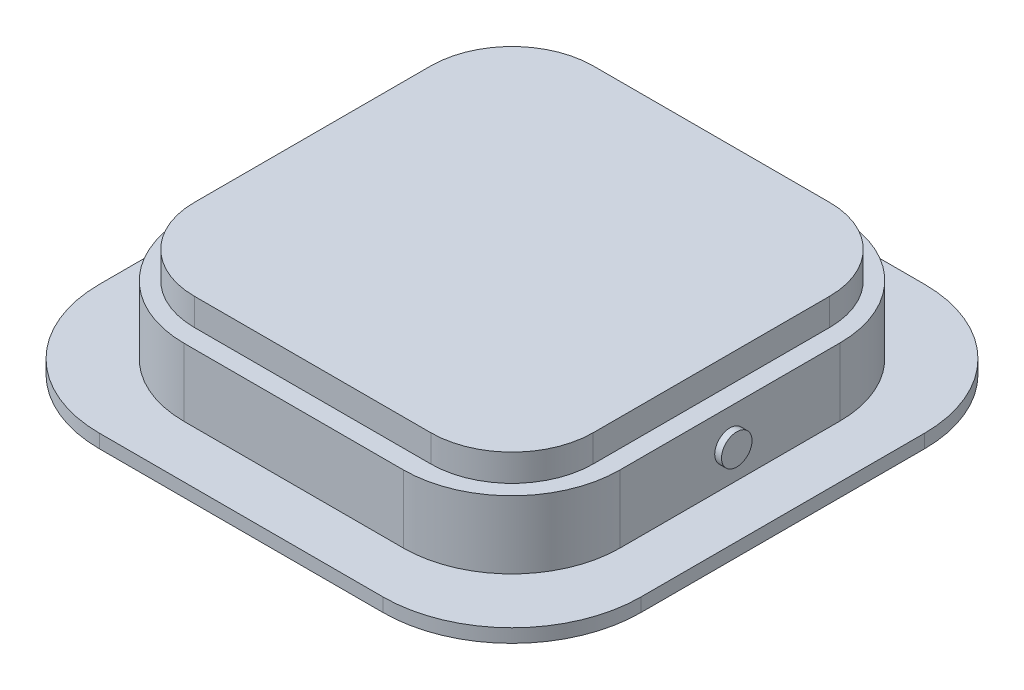
ISO-10303-21;
HEADER;
FILE_DESCRIPTION(('STEP AP214'),'2;1');
FILE_NAME('part.step','',(''),(''),'','','');
FILE_SCHEMA(('AUTOMOTIVE_DESIGN { 1 0 10303 214 1 1 1 1 }'));
ENDSEC;
DATA;
#1=APPLICATION_CONTEXT('core data for automotive mechanical design processes');
#2=APPLICATION_PROTOCOL_DEFINITION('international standard','automotive_design',2000,#1);
#3=PRODUCT_CONTEXT('',#1,'mechanical');
#4=PRODUCT('Part','Part','',(#3));
#5=PRODUCT_RELATED_PRODUCT_CATEGORY('part','',(#4));
#6=PRODUCT_DEFINITION_FORMATION('','',#4);
#7=PRODUCT_DEFINITION_CONTEXT('part definition',#1,'design');
#8=PRODUCT_DEFINITION('design','',#6,#7);
#9=PRODUCT_DEFINITION_SHAPE('','',#8);
#10=(LENGTH_UNIT() NAMED_UNIT(*) SI_UNIT(.MILLI.,.METRE.));
#11=(NAMED_UNIT(*) PLANE_ANGLE_UNIT() SI_UNIT($,.RADIAN.));
#12=(NAMED_UNIT(*) SI_UNIT($,.STERADIAN.) SOLID_ANGLE_UNIT());
#13=UNCERTAINTY_MEASURE_WITH_UNIT(LENGTH_MEASURE(1.E-05),#10,'distance_accuracy_value','');
#14=(GEOMETRIC_REPRESENTATION_CONTEXT(3) GLOBAL_UNCERTAINTY_ASSIGNED_CONTEXT((#13)) GLOBAL_UNIT_ASSIGNED_CONTEXT((#10,
#11,#12)) REPRESENTATION_CONTEXT('',''));
#15=CARTESIAN_POINT('',(0.,0.,0.));
#16=DIRECTION('',(0.,0.,1.));
#17=DIRECTION('',(1.,0.,0.));
#18=AXIS2_PLACEMENT_3D('',#15,#16,#17);
#19=CARTESIAN_POINT('',(16.1,-5.,-8.12228811403894));
#20=DIRECTION('',(-1.,0.,0.));
#21=DIRECTION('',(0.,0.,1.));
#22=AXIS2_PLACEMENT_3D('',#19,#20,#21);
#23=PLANE('',#22);
#24=DIRECTION('',(0.,0.,1.));
#25=VECTOR('',#24,1.);
#26=CARTESIAN_POINT('',(16.1,0.,-8.12228811403894));
#27=LINE('',#26,#25);
#28=CARTESIAN_POINT('',(16.1,0.,-8.12228811403894));
#29=VERTEX_POINT('',#28);
#30=CARTESIAN_POINT('',(16.1,0.,8.12228811403895));
#31=VERTEX_POINT('',#30);
#32=EDGE_CURVE('E367',#29,#31,#27,.T.);
#33=ORIENTED_EDGE('',*,*,#32,.T.);
#34=DIRECTION('',(0.,1.,0.));
#35=VECTOR('',#34,1.);
#36=CARTESIAN_POINT('',(16.1,-5.,8.12228811403895));
#37=LINE('',#36,#35);
#38=CARTESIAN_POINT('',(16.1,-5.,8.12228811403895));
#39=VERTEX_POINT('',#38);
#40=EDGE_CURVE('E397',#39,#31,#37,.T.);
#41=ORIENTED_EDGE('',*,*,#40,.F.);
#42=DIRECTION('',(0.,0.,1.));
#43=VECTOR('',#42,1.);
#44=CARTESIAN_POINT('',(16.1,-5.,-8.12228811403894));
#45=LINE('',#44,#43);
#46=CARTESIAN_POINT('',(16.1,-5.,-8.12228811403894));
#47=VERTEX_POINT('',#46);
#48=EDGE_CURVE('E342',#47,#39,#45,.T.);
#49=ORIENTED_EDGE('',*,*,#48,.F.);
#50=DIRECTION('',(0.,1.,0.));
#51=VECTOR('',#50,1.);
#52=CARTESIAN_POINT('',(16.1,-5.,-8.12228811403894));
#53=LINE('',#52,#51);
#54=EDGE_CURVE('E400',#47,#29,#53,.T.);
#55=ORIENTED_EDGE('',*,*,#54,.T.);
#56=EDGE_LOOP('',(#33,#41,#49,#55));
#57=FACE_BOUND('',#56,.T.);
#58=CARTESIAN_POINT('',(16.1,-2.5,0.));
#59=DIRECTION('',(-1.,0.,0.));
#60=DIRECTION('',(0.,0.,1.));
#61=AXIS2_PLACEMENT_3D('',#58,#59,#60);
#62=CIRCLE('',#61,1.12761712492703);
#63=CARTESIAN_POINT('',(16.1,-2.5,1.12761712492703));
#64=VERTEX_POINT('',#63);
#65=EDGE_CURVE('E13',#64,#64,#62,.F.);
#66=ORIENTED_EDGE('',*,*,#65,.F.);
#67=EDGE_LOOP('',(#66));
#68=FACE_BOUND('',#67,.T.);
#69=ADVANCED_FACE('F45',(#57,#68),#23,.F.);
#70=CARTESIAN_POINT('',(-10.47496,-6.,-10.475));
#71=DIRECTION('',(0.,1.,0.));
#72=DIRECTION('',(0.,0.,1.));
#73=AXIS2_PLACEMENT_3D('',#70,#71,#72);
#74=PLANE('',#73);
#75=CARTESIAN_POINT('',(-10.47496,-6.,-10.475));
#76=DIRECTION('',(0.,-1.,0.));
#77=DIRECTION('',(0.,0.,1.));
#78=AXIS2_PLACEMENT_3D('',#75,#76,#77);
#79=CIRCLE('',#78,9.525);
#80=CARTESIAN_POINT('',(-19.99996,-6.,-10.4749999999999));
#81=VERTEX_POINT('',#80);
#82=CARTESIAN_POINT('',(-10.4749599999999,-6.,-20.));
#83=VERTEX_POINT('',#82);
#84=EDGE_CURVE('E284',#81,#83,#79,.T.);
#85=ORIENTED_EDGE('',*,*,#84,.T.);
#86=DIRECTION('',(1.,0.,0.));
#87=VECTOR('',#86,1.);
#88=CARTESIAN_POINT('',(10.4749599999999,-6.,-20.));
#89=LINE('',#88,#87);
#90=CARTESIAN_POINT('',(10.4749599999999,-6.,-20.));
#91=VERTEX_POINT('',#90);
#92=EDGE_CURVE('E287',#83,#91,#89,.T.);
#93=ORIENTED_EDGE('',*,*,#92,.T.);
#94=CARTESIAN_POINT('',(10.47496,-6.,-10.475));
#95=DIRECTION('',(0.,-1.,0.));
#96=DIRECTION('',(0.,0.,-1.));
#97=AXIS2_PLACEMENT_3D('',#94,#95,#96);
#98=CIRCLE('',#97,9.525);
#99=CARTESIAN_POINT('',(19.99996,-6.,-10.4749999999999));
#100=VERTEX_POINT('',#99);
#101=EDGE_CURVE('E290',#91,#100,#98,.T.);
#102=ORIENTED_EDGE('',*,*,#101,.T.);
#103=DIRECTION('',(0.,0.,1.));
#104=VECTOR('',#103,1.);
#105=CARTESIAN_POINT('',(19.99996,-6.,-10.4749999999999));
#106=LINE('',#105,#104);
#107=CARTESIAN_POINT('',(19.99996,-6.,10.4749999999999));
#108=VERTEX_POINT('',#107);
#109=EDGE_CURVE('E292',#100,#108,#106,.T.);
#110=ORIENTED_EDGE('',*,*,#109,.T.);
#111=CARTESIAN_POINT('',(10.47496,-6.,10.475));
#112=DIRECTION('',(0.,-1.,0.));
#113=DIRECTION('',(0.,0.,-1.));
#114=AXIS2_PLACEMENT_3D('',#111,#112,#113);
#115=CIRCLE('',#114,9.525);
#116=CARTESIAN_POINT('',(10.4749599999999,-6.,20.));
#117=VERTEX_POINT('',#116);
#118=EDGE_CURVE('E294',#108,#117,#115,.T.);
#119=ORIENTED_EDGE('',*,*,#118,.T.);
#120=DIRECTION('',(-1.,0.,0.));
#121=VECTOR('',#120,1.);
#122=CARTESIAN_POINT('',(10.4749599999999,-6.,20.));
#123=LINE('',#122,#121);
#124=CARTESIAN_POINT('',(-10.4749599999999,-6.,20.));
#125=VERTEX_POINT('',#124);
#126=EDGE_CURVE('E296',#117,#125,#123,.T.);
#127=ORIENTED_EDGE('',*,*,#126,.T.);
#128=CARTESIAN_POINT('',(-10.47496,-6.,10.475));
#129=DIRECTION('',(0.,-1.,0.));
#130=DIRECTION('',(0.,0.,-1.));
#131=AXIS2_PLACEMENT_3D('',#128,#129,#130);
#132=CIRCLE('',#131,9.525);
#133=CARTESIAN_POINT('',(-19.99996,-6.,10.4749999999999));
#134=VERTEX_POINT('',#133);
#135=EDGE_CURVE('E298',#125,#134,#132,.T.);
#136=ORIENTED_EDGE('',*,*,#135,.T.);
#137=DIRECTION('',(0.,0.,-1.));
#138=VECTOR('',#137,1.);
#139=CARTESIAN_POINT('',(-19.99996,-6.,-10.4749999999999));
#140=LINE('',#139,#138);
#141=EDGE_CURVE('E300',#134,#81,#140,.T.);
#142=ORIENTED_EDGE('',*,*,#141,.T.);
#143=EDGE_LOOP('',(#85,#93,#102,#110,#119,#127,#136,#142));
#144=FACE_BOUND('',#143,.T.);
#145=CARTESIAN_POINT('',(-9.50000000000001,-6.,-10.25));
#146=DIRECTION('',(0.,-1.,0.));
#147=DIRECTION('',(0.,0.,1.));
#148=AXIS2_PLACEMENT_3D('',#145,#146,#147);
#149=CIRCLE('',#148,3.);
#150=CARTESIAN_POINT('',(-12.5,-6.,-10.25));
#151=VERTEX_POINT('',#150);
#152=CARTESIAN_POINT('',(-9.49999999999998,-6.,-13.25));
#153=VERTEX_POINT('',#152);
#154=EDGE_CURVE('E274',#151,#153,#149,.T.);
#155=ORIENTED_EDGE('',*,*,#154,.F.);
#156=DIRECTION('',(0.,0.,-1.));
#157=VECTOR('',#156,1.);
#158=CARTESIAN_POINT('',(-12.5,-6.,-10.25));
#159=LINE('',#158,#157);
#160=CARTESIAN_POINT('',(-12.5,-6.,10.25));
#161=VERTEX_POINT('',#160);
#162=EDGE_CURVE('E271',#161,#151,#159,.T.);
#163=ORIENTED_EDGE('',*,*,#162,.F.);
#164=CARTESIAN_POINT('',(-9.5,-6.,10.25));
#165=DIRECTION('',(0.,-1.,0.));
#166=DIRECTION('',(0.,0.,-1.));
#167=AXIS2_PLACEMENT_3D('',#164,#165,#166);
#168=CIRCLE('',#167,3.);
#169=CARTESIAN_POINT('',(-9.5,-6.,13.25));
#170=VERTEX_POINT('',#169);
#171=EDGE_CURVE('E670',#170,#161,#168,.T.);
#172=ORIENTED_EDGE('',*,*,#171,.F.);
#173=DIRECTION('',(-1.,0.,0.));
#174=VECTOR('',#173,1.);
#175=CARTESIAN_POINT('',(9.49999999999998,-6.,13.25));
#176=LINE('',#175,#174);
#177=CARTESIAN_POINT('',(9.49999999999998,-6.,13.25));
#178=VERTEX_POINT('',#177);
#179=EDGE_CURVE('E667',#178,#170,#176,.T.);
#180=ORIENTED_EDGE('',*,*,#179,.F.);
#181=CARTESIAN_POINT('',(9.5,-6.,10.25));
#182=DIRECTION('',(0.,-1.,0.));
#183=DIRECTION('',(0.,0.,-1.));
#184=AXIS2_PLACEMENT_3D('',#181,#182,#183);
#185=CIRCLE('',#184,3.);
#186=CARTESIAN_POINT('',(12.5,-6.,10.25));
#187=VERTEX_POINT('',#186);
#188=EDGE_CURVE('E664',#187,#178,#185,.T.);
#189=ORIENTED_EDGE('',*,*,#188,.F.);
#190=DIRECTION('',(0.,0.,1.));
#191=VECTOR('',#190,1.);
#192=CARTESIAN_POINT('',(12.5,-6.,-10.25));
#193=LINE('',#192,#191);
#194=CARTESIAN_POINT('',(12.5,-6.,-10.25));
#195=VERTEX_POINT('',#194);
#196=EDGE_CURVE('E661',#195,#187,#193,.T.);
#197=ORIENTED_EDGE('',*,*,#196,.F.);
#198=CARTESIAN_POINT('',(9.5,-6.,-10.25));
#199=DIRECTION('',(0.,-1.,0.));
#200=DIRECTION('',(0.,0.,-1.));
#201=AXIS2_PLACEMENT_3D('',#198,#199,#200);
#202=CIRCLE('',#201,3.);
#203=CARTESIAN_POINT('',(9.49999999999998,-6.,-13.25));
#204=VERTEX_POINT('',#203);
#205=EDGE_CURVE('E65',#204,#195,#202,.T.);
#206=ORIENTED_EDGE('',*,*,#205,.F.);
#207=DIRECTION('',(1.,0.,0.));
#208=VECTOR('',#207,1.);
#209=CARTESIAN_POINT('',(9.49999999999998,-6.,-13.25));
#210=LINE('',#209,#208);
#211=EDGE_CURVE('E60',#153,#204,#210,.T.);
#212=ORIENTED_EDGE('',*,*,#211,.F.);
#213=EDGE_LOOP('',(#155,#163,#172,#180,#189,#197,#206,#212));
#214=FACE_BOUND('',#213,.T.);
#215=ADVANCED_FACE('F511',(#144,#214),#74,.F.);
#216=CARTESIAN_POINT('',(-8.732,2.,8.73200000000001));
#217=DIRECTION('',(0.,-1.,0.));
#218=DIRECTION('',(0.,0.,-1.));
#219=AXIS2_PLACEMENT_3D('',#216,#217,#218);
#220=CYLINDRICAL_SURFACE('',#219,6.);
#221=CARTESIAN_POINT('',(-8.732,0.,8.73200000000001));
#222=DIRECTION('',(0.,1.,0.));
#223=DIRECTION('',(0.,0.,-1.));
#224=AXIS2_PLACEMENT_3D('',#221,#222,#223);
#225=CIRCLE('',#224,6.);
#226=CARTESIAN_POINT('',(-14.732,0.,8.73199999999997));
#227=VERTEX_POINT('',#226);
#228=CARTESIAN_POINT('',(-8.73199999999995,0.,14.732));
#229=VERTEX_POINT('',#228);
#230=EDGE_CURVE('E403',#227,#229,#225,.T.);
#231=ORIENTED_EDGE('',*,*,#230,.T.);
#232=DIRECTION('',(0.,-1.,0.));
#233=VECTOR('',#232,1.);
#234=CARTESIAN_POINT('',(-8.73199999999996,2.,14.732));
#235=LINE('',#234,#233);
#236=CARTESIAN_POINT('',(-8.73199999999996,2.,14.732));
#237=VERTEX_POINT('',#236);
#238=EDGE_CURVE('E53',#237,#229,#235,.T.);
#239=ORIENTED_EDGE('',*,*,#238,.F.);
#240=CARTESIAN_POINT('',(-8.732,2.,8.73200000000001));
#241=DIRECTION('',(0.,1.,0.));
#242=DIRECTION('',(0.,0.,-1.));
#243=AXIS2_PLACEMENT_3D('',#240,#241,#242);
#244=CIRCLE('',#243,6.);
#245=CARTESIAN_POINT('',(-14.732,2.,8.73199999999997));
#246=VERTEX_POINT('',#245);
#247=EDGE_CURVE('E404',#246,#237,#244,.T.);
#248=ORIENTED_EDGE('',*,*,#247,.F.);
#249=DIRECTION('',(0.,-1.,0.));
#250=VECTOR('',#249,1.);
#251=CARTESIAN_POINT('',(-14.732,2.,8.73199999999997));
#252=LINE('',#251,#250);
#253=EDGE_CURVE('E422',#246,#227,#252,.T.);
#254=ORIENTED_EDGE('',*,*,#253,.T.);
#255=EDGE_LOOP('',(#231,#239,#248,#254));
#256=FACE_BOUND('',#255,.T.);
#257=ADVANCED_FACE('F47',(#256),#220,.T.);
#258=CARTESIAN_POINT('',(8.73199999999995,2.,14.732));
#259=DIRECTION('',(0.,0.,-1.));
#260=DIRECTION('',(-1.,0.,0.));
#261=AXIS2_PLACEMENT_3D('',#258,#259,#260);
#262=PLANE('',#261);
#263=DIRECTION('',(1.,0.,0.));
#264=VECTOR('',#263,1.);
#265=CARTESIAN_POINT('',(8.73199999999995,0.,14.732));
#266=LINE('',#265,#264);
#267=CARTESIAN_POINT('',(8.73199999999995,0.,14.732));
#268=VERTEX_POINT('',#267);
#269=EDGE_CURVE('E425',#229,#268,#266,.T.);
#270=ORIENTED_EDGE('',*,*,#269,.T.);
#271=DIRECTION('',(0.,-1.,0.));
#272=VECTOR('',#271,1.);
#273=CARTESIAN_POINT('',(8.73199999999995,2.,14.732));
#274=LINE('',#273,#272);
#275=CARTESIAN_POINT('',(8.73199999999995,2.,14.732));
#276=VERTEX_POINT('',#275);
#277=EDGE_CURVE('E462',#276,#268,#274,.T.);
#278=ORIENTED_EDGE('',*,*,#277,.F.);
#279=DIRECTION('',(1.,0.,0.));
#280=VECTOR('',#279,1.);
#281=CARTESIAN_POINT('',(8.73199999999995,2.,14.732));
#282=LINE('',#281,#280);
#283=EDGE_CURVE('E407',#237,#276,#282,.T.);
#284=ORIENTED_EDGE('',*,*,#283,.F.);
#285=ORIENTED_EDGE('',*,*,#238,.T.);
#286=EDGE_LOOP('',(#270,#278,#284,#285));
#287=FACE_BOUND('',#286,.T.);
#288=ADVANCED_FACE('F467',(#287),#262,.F.);
#289=CARTESIAN_POINT('',(8.732,2.,8.732));
#290=DIRECTION('',(0.,-1.,0.));
#291=DIRECTION('',(0.,0.,-1.));
#292=AXIS2_PLACEMENT_3D('',#289,#290,#291);
#293=CYLINDRICAL_SURFACE('',#292,6.);
#294=CARTESIAN_POINT('',(8.732,0.,8.732));
#295=DIRECTION('',(0.,1.,0.));
#296=DIRECTION('',(0.,0.,1.));
#297=AXIS2_PLACEMENT_3D('',#294,#295,#296);
#298=CIRCLE('',#297,6.);
#299=CARTESIAN_POINT('',(14.732,0.,8.73199999999996));
#300=VERTEX_POINT('',#299);
#301=EDGE_CURVE('E428',#268,#300,#298,.T.);
#302=ORIENTED_EDGE('',*,*,#301,.T.);
#303=DIRECTION('',(0.,-1.,0.));
#304=VECTOR('',#303,1.);
#305=CARTESIAN_POINT('',(14.732,2.,8.73199999999996));
#306=LINE('',#305,#304);
#307=CARTESIAN_POINT('',(14.732,2.,8.73199999999996));
#308=VERTEX_POINT('',#307);
#309=EDGE_CURVE('E459',#308,#300,#306,.T.);
#310=ORIENTED_EDGE('',*,*,#309,.F.);
#311=CARTESIAN_POINT('',(8.732,2.,8.732));
#312=DIRECTION('',(0.,1.,0.));
#313=DIRECTION('',(0.,0.,1.));
#314=AXIS2_PLACEMENT_3D('',#311,#312,#313);
#315=CIRCLE('',#314,6.);
#316=EDGE_CURVE('E410',#276,#308,#315,.T.);
#317=ORIENTED_EDGE('',*,*,#316,.F.);
#318=ORIENTED_EDGE('',*,*,#277,.T.);
#319=EDGE_LOOP('',(#302,#310,#317,#318));
#320=FACE_BOUND('',#319,.T.);
#321=ADVANCED_FACE('F496',(#320),#293,.T.);
#322=CARTESIAN_POINT('',(14.732,2.,8.73199999999995));
#323=DIRECTION('',(-1.,0.,0.));
#324=DIRECTION('',(0.,0.,1.));
#325=AXIS2_PLACEMENT_3D('',#322,#323,#324);
#326=PLANE('',#325);
#327=DIRECTION('',(0.,0.,-1.));
#328=VECTOR('',#327,1.);
#329=CARTESIAN_POINT('',(14.732,0.,8.73199999999995));
#330=LINE('',#329,#328);
#331=CARTESIAN_POINT('',(14.732,0.,-8.73199999999996));
#332=VERTEX_POINT('',#331);
#333=EDGE_CURVE('E431',#300,#332,#330,.T.);
#334=ORIENTED_EDGE('',*,*,#333,.T.);
#335=DIRECTION('',(0.,-1.,0.));
#336=VECTOR('',#335,1.);
#337=CARTESIAN_POINT('',(14.732,2.,-8.73199999999996));
#338=LINE('',#337,#336);
#339=CARTESIAN_POINT('',(14.732,2.,-8.73199999999996));
#340=VERTEX_POINT('',#339);
#341=EDGE_CURVE('E456',#340,#332,#338,.T.);
#342=ORIENTED_EDGE('',*,*,#341,.F.);
#343=DIRECTION('',(0.,0.,-1.));
#344=VECTOR('',#343,1.);
#345=CARTESIAN_POINT('',(14.732,2.,8.73199999999995));
#346=LINE('',#345,#344);
#347=EDGE_CURVE('E412',#308,#340,#346,.T.);
#348=ORIENTED_EDGE('',*,*,#347,.F.);
#349=ORIENTED_EDGE('',*,*,#309,.T.);
#350=EDGE_LOOP('',(#334,#342,#348,#349));
#351=FACE_BOUND('',#350,.T.);
#352=ADVANCED_FACE('F491',(#351),#326,.F.);
#353=CARTESIAN_POINT('',(8.732,2.,-8.732));
#354=DIRECTION('',(0.,-1.,0.));
#355=DIRECTION('',(0.,0.,-1.));
#356=AXIS2_PLACEMENT_3D('',#353,#354,#355);
#357=CYLINDRICAL_SURFACE('',#356,6.);
#358=CARTESIAN_POINT('',(8.732,0.,-8.732));
#359=DIRECTION('',(0.,1.,0.));
#360=DIRECTION('',(0.,0.,1.));
#361=AXIS2_PLACEMENT_3D('',#358,#359,#360);
#362=CIRCLE('',#361,6.);
#363=CARTESIAN_POINT('',(8.73199999999996,0.,-14.732));
#364=VERTEX_POINT('',#363);
#365=EDGE_CURVE('E434',#332,#364,#362,.T.);
#366=ORIENTED_EDGE('',*,*,#365,.T.);
#367=DIRECTION('',(0.,-1.,0.));
#368=VECTOR('',#367,1.);
#369=CARTESIAN_POINT('',(8.73199999999996,2.,-14.732));
#370=LINE('',#369,#368);
#371=CARTESIAN_POINT('',(8.73199999999996,2.,-14.732));
#372=VERTEX_POINT('',#371);
#373=EDGE_CURVE('E453',#372,#364,#370,.T.);
#374=ORIENTED_EDGE('',*,*,#373,.F.);
#375=CARTESIAN_POINT('',(8.732,2.,-8.732));
#376=DIRECTION('',(0.,1.,0.));
#377=DIRECTION('',(0.,0.,1.));
#378=AXIS2_PLACEMENT_3D('',#375,#376,#377);
#379=CIRCLE('',#378,6.);
#380=EDGE_CURVE('E414',#340,#372,#379,.T.);
#381=ORIENTED_EDGE('',*,*,#380,.F.);
#382=ORIENTED_EDGE('',*,*,#341,.T.);
#383=EDGE_LOOP('',(#366,#374,#381,#382));
#384=FACE_BOUND('',#383,.T.);
#385=ADVANCED_FACE('F488',(#384),#357,.T.);
#386=CARTESIAN_POINT('',(8.73199999999996,2.,-14.732));
#387=DIRECTION('',(0.,0.,1.));
#388=DIRECTION('',(1.,0.,0.));
#389=AXIS2_PLACEMENT_3D('',#386,#387,#388);
#390=PLANE('',#389);
#391=DIRECTION('',(-1.,0.,0.));
#392=VECTOR('',#391,1.);
#393=CARTESIAN_POINT('',(8.73199999999996,0.,-14.732));
#394=LINE('',#393,#392);
#395=CARTESIAN_POINT('',(-8.732,0.,-14.732));
#396=VERTEX_POINT('',#395);
#397=EDGE_CURVE('E437',#364,#396,#394,.T.);
#398=ORIENTED_EDGE('',*,*,#397,.T.);
#399=DIRECTION('',(0.,-1.,0.));
#400=VECTOR('',#399,1.);
#401=CARTESIAN_POINT('',(-8.73199999999996,2.,-14.732));
#402=LINE('',#401,#400);
#403=CARTESIAN_POINT('',(-8.73199999999996,2.,-14.732));
#404=VERTEX_POINT('',#403);
#405=EDGE_CURVE('E450',#404,#396,#402,.T.);
#406=ORIENTED_EDGE('',*,*,#405,.F.);
#407=DIRECTION('',(-1.,0.,0.));
#408=VECTOR('',#407,1.);
#409=CARTESIAN_POINT('',(8.73199999999996,2.,-14.732));
#410=LINE('',#409,#408);
#411=EDGE_CURVE('E416',#372,#404,#410,.T.);
#412=ORIENTED_EDGE('',*,*,#411,.F.);
#413=ORIENTED_EDGE('',*,*,#373,.T.);
#414=EDGE_LOOP('',(#398,#406,#412,#413));
#415=FACE_BOUND('',#414,.T.);
#416=ADVANCED_FACE('F483',(#415),#390,.F.);
#417=CARTESIAN_POINT('',(-8.732,2.,-8.73199999999999));
#418=DIRECTION('',(0.,-1.,0.));
#419=DIRECTION('',(0.,0.,-1.));
#420=AXIS2_PLACEMENT_3D('',#417,#418,#419);
#421=CYLINDRICAL_SURFACE('',#420,6.);
#422=CARTESIAN_POINT('',(-8.732,0.,-8.73199999999999));
#423=DIRECTION('',(0.,1.,0.));
#424=DIRECTION('',(0.,0.,1.));
#425=AXIS2_PLACEMENT_3D('',#422,#423,#424);
#426=CIRCLE('',#425,6.);
#427=CARTESIAN_POINT('',(-14.732,0.,-8.73199999999995));
#428=VERTEX_POINT('',#427);
#429=EDGE_CURVE('E440',#396,#428,#426,.T.);
#430=ORIENTED_EDGE('',*,*,#429,.T.);
#431=DIRECTION('',(0.,-1.,0.));
#432=VECTOR('',#431,1.);
#433=CARTESIAN_POINT('',(-14.732,2.,-8.73199999999995));
#434=LINE('',#433,#432);
#435=CARTESIAN_POINT('',(-14.732,2.,-8.73199999999995));
#436=VERTEX_POINT('',#435);
#437=EDGE_CURVE('E447',#436,#428,#434,.T.);
#438=ORIENTED_EDGE('',*,*,#437,.F.);
#439=CARTESIAN_POINT('',(-8.732,2.,-8.73199999999999));
#440=DIRECTION('',(0.,1.,0.));
#441=DIRECTION('',(0.,0.,1.));
#442=AXIS2_PLACEMENT_3D('',#439,#440,#441);
#443=CIRCLE('',#442,6.);
#444=EDGE_CURVE('E418',#404,#436,#443,.T.);
#445=ORIENTED_EDGE('',*,*,#444,.F.);
#446=ORIENTED_EDGE('',*,*,#405,.T.);
#447=EDGE_LOOP('',(#430,#438,#445,#446));
#448=FACE_BOUND('',#447,.T.);
#449=ADVANCED_FACE('F480',(#448),#421,.T.);
#450=CARTESIAN_POINT('',(-14.732,2.,8.73199999999997));
#451=DIRECTION('',(1.,0.,0.));
#452=DIRECTION('',(0.,0.,-1.));
#453=AXIS2_PLACEMENT_3D('',#450,#451,#452);
#454=PLANE('',#453);
#455=DIRECTION('',(0.,0.,1.));
#456=VECTOR('',#455,1.);
#457=CARTESIAN_POINT('',(-14.732,0.,8.73199999999997));
#458=LINE('',#457,#456);
#459=EDGE_CURVE('E408',#428,#227,#458,.T.);
#460=ORIENTED_EDGE('',*,*,#459,.T.);
#461=ORIENTED_EDGE('',*,*,#253,.F.);
#462=DIRECTION('',(0.,0.,1.));
#463=VECTOR('',#462,1.);
#464=CARTESIAN_POINT('',(-14.732,2.,8.73199999999997));
#465=LINE('',#464,#463);
#466=EDGE_CURVE('E420',#436,#246,#465,.T.);
#467=ORIENTED_EDGE('',*,*,#466,.F.);
#468=ORIENTED_EDGE('',*,*,#437,.T.);
#469=EDGE_LOOP('',(#460,#461,#467,#468));
#470=FACE_BOUND('',#469,.T.);
#471=ADVANCED_FACE('F475',(#470),#454,.F.);
#472=CARTESIAN_POINT('',(-8.732,2.,8.73200000000001));
#473=DIRECTION('',(0.,-1.,0.));
#474=DIRECTION('',(0.,0.,-1.));
#475=AXIS2_PLACEMENT_3D('',#472,#473,#474);
#476=PLANE('',#475);
#477=ORIENTED_EDGE('',*,*,#247,.T.);
#478=ORIENTED_EDGE('',*,*,#283,.T.);
#479=ORIENTED_EDGE('',*,*,#316,.T.);
#480=ORIENTED_EDGE('',*,*,#347,.T.);
#481=ORIENTED_EDGE('',*,*,#380,.T.);
#482=ORIENTED_EDGE('',*,*,#411,.T.);
#483=ORIENTED_EDGE('',*,*,#444,.T.);
#484=ORIENTED_EDGE('',*,*,#466,.T.);
#485=EDGE_LOOP('',(#477,#478,#479,#480,#481,#482,#483,#484));
#486=FACE_BOUND('',#485,.T.);
#487=ADVANCED_FACE('F498',(#486),#476,.F.);
#488=CARTESIAN_POINT('',(8.1,0.,-8.122288114039));
#489=DIRECTION('',(0.,-1.,0.));
#490=DIRECTION('',(0.,0.,-1.));
#491=AXIS2_PLACEMENT_3D('',#488,#489,#490);
#492=PLANE('',#491);
#493=CARTESIAN_POINT('',(8.1,0.,-8.122288114039));
#494=DIRECTION('',(0.,-1.,0.));
#495=DIRECTION('',(0.,0.,-1.));
#496=AXIS2_PLACEMENT_3D('',#493,#494,#495);
#497=CIRCLE('',#496,8.);
#498=CARTESIAN_POINT('',(8.09999999999994,0.,-16.122288114039));
#499=VERTEX_POINT('',#498);
#500=EDGE_CURVE('E338',#499,#29,#497,.T.);
#501=ORIENTED_EDGE('',*,*,#500,.F.);
#502=DIRECTION('',(1.,0.,0.));
#503=VECTOR('',#502,1.);
#504=CARTESIAN_POINT('',(8.09999999999994,0.,-16.122288114039));
#505=LINE('',#504,#503);
#506=CARTESIAN_POINT('',(-8.09999999999994,0.,-16.122288114039));
#507=VERTEX_POINT('',#506);
#508=EDGE_CURVE('E343',#507,#499,#505,.T.);
#509=ORIENTED_EDGE('',*,*,#508,.F.);
#510=CARTESIAN_POINT('',(-8.1,0.,-8.122288114039));
#511=DIRECTION('',(0.,-1.,0.));
#512=DIRECTION('',(0.,0.,1.));
#513=AXIS2_PLACEMENT_3D('',#510,#511,#512);
#514=CIRCLE('',#513,8.);
#515=CARTESIAN_POINT('',(-16.1,0.,-8.12228811403894));
#516=VERTEX_POINT('',#515);
#517=EDGE_CURVE('E377',#516,#507,#514,.T.);
#518=ORIENTED_EDGE('',*,*,#517,.F.);
#519=DIRECTION('',(0.,0.,-1.));
#520=VECTOR('',#519,1.);
#521=CARTESIAN_POINT('',(-16.1,0.,-8.12228811403894));
#522=LINE('',#521,#520);
#523=CARTESIAN_POINT('',(-16.1,0.,8.12228811403894));
#524=VERTEX_POINT('',#523);
#525=EDGE_CURVE('E375',#524,#516,#522,.T.);
#526=ORIENTED_EDGE('',*,*,#525,.F.);
#527=CARTESIAN_POINT('',(-8.1,0.,8.122288114039));
#528=DIRECTION('',(0.,-1.,0.));
#529=DIRECTION('',(0.,0.,-1.));
#530=AXIS2_PLACEMENT_3D('',#527,#528,#529);
#531=CIRCLE('',#530,8.);
#532=CARTESIAN_POINT('',(-8.09999999999994,0.,16.122288114039));
#533=VERTEX_POINT('',#532);
#534=EDGE_CURVE('E373',#533,#524,#531,.T.);
#535=ORIENTED_EDGE('',*,*,#534,.F.);
#536=DIRECTION('',(-1.,0.,0.));
#537=VECTOR('',#536,1.);
#538=CARTESIAN_POINT('',(8.09999999999994,0.,16.122288114039));
#539=LINE('',#538,#537);
#540=CARTESIAN_POINT('',(8.09999999999994,0.,16.122288114039));
#541=VERTEX_POINT('',#540);
#542=EDGE_CURVE('E371',#541,#533,#539,.T.);
#543=ORIENTED_EDGE('',*,*,#542,.F.);
#544=CARTESIAN_POINT('',(8.1,0.,8.122288114039));
#545=DIRECTION('',(0.,-1.,0.));
#546=DIRECTION('',(0.,0.,-1.));
#547=AXIS2_PLACEMENT_3D('',#544,#545,#546);
#548=CIRCLE('',#547,8.);
#549=EDGE_CURVE('E369',#31,#541,#548,.T.);
#550=ORIENTED_EDGE('',*,*,#549,.F.);
#551=ORIENTED_EDGE('',*,*,#32,.F.);
#552=EDGE_LOOP('',(#501,#509,#518,#526,#535,#543,#550,#551));
#553=FACE_BOUND('',#552,.T.);
#554=ORIENTED_EDGE('',*,*,#269,.F.);
#555=ORIENTED_EDGE('',*,*,#230,.F.);
#556=ORIENTED_EDGE('',*,*,#459,.F.);
#557=ORIENTED_EDGE('',*,*,#429,.F.);
#558=ORIENTED_EDGE('',*,*,#397,.F.);
#559=ORIENTED_EDGE('',*,*,#365,.F.);
#560=ORIENTED_EDGE('',*,*,#333,.F.);
#561=ORIENTED_EDGE('',*,*,#301,.F.);
#562=EDGE_LOOP('',(#554,#555,#556,#557,#558,#559,#560,#561));
#563=FACE_BOUND('',#562,.T.);
#564=ADVANCED_FACE('F473',(#553,#563),#492,.F.);
#565=CARTESIAN_POINT('',(8.1,-5.,-8.122288114039));
#566=DIRECTION('',(0.,1.,0.));
#567=DIRECTION('',(0.,0.,1.));
#568=AXIS2_PLACEMENT_3D('',#565,#566,#567);
#569=CYLINDRICAL_SURFACE('',#568,8.);
#570=ORIENTED_EDGE('',*,*,#500,.T.);
#571=ORIENTED_EDGE('',*,*,#54,.F.);
#572=CARTESIAN_POINT('',(8.1,-5.,-8.122288114039));
#573=DIRECTION('',(0.,-1.,0.));
#574=DIRECTION('',(0.,0.,-1.));
#575=AXIS2_PLACEMENT_3D('',#572,#573,#574);
#576=CIRCLE('',#575,8.);
#577=CARTESIAN_POINT('',(8.09999999999994,-5.,-16.122288114039));
#578=VERTEX_POINT('',#577);
#579=EDGE_CURVE('E339',#578,#47,#576,.T.);
#580=ORIENTED_EDGE('',*,*,#579,.F.);
#581=DIRECTION('',(0.,1.,0.));
#582=VECTOR('',#581,1.);
#583=CARTESIAN_POINT('',(8.09999999999994,-5.,-16.122288114039));
#584=LINE('',#583,#582);
#585=EDGE_CURVE('E364',#578,#499,#584,.T.);
#586=ORIENTED_EDGE('',*,*,#585,.T.);
#587=EDGE_LOOP('',(#570,#571,#580,#586));
#588=FACE_BOUND('',#587,.T.);
#589=ADVANCED_FACE('F505',(#588),#569,.T.);
#590=CARTESIAN_POINT('',(8.1,-5.,8.122288114039));
#591=DIRECTION('',(0.,1.,0.));
#592=DIRECTION('',(0.,0.,1.));
#593=AXIS2_PLACEMENT_3D('',#590,#591,#592);
#594=CYLINDRICAL_SURFACE('',#593,8.);
#595=ORIENTED_EDGE('',*,*,#549,.T.);
#596=DIRECTION('',(0.,1.,0.));
#597=VECTOR('',#596,1.);
#598=CARTESIAN_POINT('',(8.09999999999994,-5.,16.122288114039));
#599=LINE('',#598,#597);
#600=CARTESIAN_POINT('',(8.09999999999994,-5.,16.122288114039));
#601=VERTEX_POINT('',#600);
#602=EDGE_CURVE('E394',#601,#541,#599,.T.);
#603=ORIENTED_EDGE('',*,*,#602,.F.);
#604=CARTESIAN_POINT('',(8.1,-5.,8.122288114039));
#605=DIRECTION('',(0.,-1.,0.));
#606=DIRECTION('',(0.,0.,-1.));
#607=AXIS2_PLACEMENT_3D('',#604,#605,#606);
#608=CIRCLE('',#607,8.);
#609=EDGE_CURVE('E346',#39,#601,#608,.T.);
#610=ORIENTED_EDGE('',*,*,#609,.F.);
#611=ORIENTED_EDGE('',*,*,#40,.T.);
#612=EDGE_LOOP('',(#595,#603,#610,#611));
#613=FACE_BOUND('',#612,.T.);
#614=ADVANCED_FACE('F521',(#613),#594,.T.);
#615=CARTESIAN_POINT('',(8.09999999999994,-5.,16.122288114039));
#616=DIRECTION('',(0.,0.,-1.));
#617=DIRECTION('',(-1.,0.,0.));
#618=AXIS2_PLACEMENT_3D('',#615,#616,#617);
#619=PLANE('',#618);
#620=ORIENTED_EDGE('',*,*,#542,.T.);
#621=DIRECTION('',(0.,1.,0.));
#622=VECTOR('',#621,1.);
#623=CARTESIAN_POINT('',(-8.09999999999994,-5.,16.122288114039));
#624=LINE('',#623,#622);
#625=CARTESIAN_POINT('',(-8.09999999999994,-5.,16.122288114039));
#626=VERTEX_POINT('',#625);
#627=EDGE_CURVE('E391',#626,#533,#624,.T.);
#628=ORIENTED_EDGE('',*,*,#627,.F.);
#629=DIRECTION('',(-1.,0.,0.));
#630=VECTOR('',#629,1.);
#631=CARTESIAN_POINT('',(8.09999999999994,-5.,16.122288114039));
#632=LINE('',#631,#630);
#633=EDGE_CURVE('E349',#601,#626,#632,.T.);
#634=ORIENTED_EDGE('',*,*,#633,.F.);
#635=ORIENTED_EDGE('',*,*,#602,.T.);
#636=EDGE_LOOP('',(#620,#628,#634,#635));
#637=FACE_BOUND('',#636,.T.);
#638=ADVANCED_FACE('F528',(#637),#619,.F.);
#639=CARTESIAN_POINT('',(-8.1,-5.,8.122288114039));
#640=DIRECTION('',(0.,1.,0.));
#641=DIRECTION('',(0.,0.,1.));
#642=AXIS2_PLACEMENT_3D('',#639,#640,#641);
#643=CYLINDRICAL_SURFACE('',#642,8.);
#644=ORIENTED_EDGE('',*,*,#534,.T.);
#645=DIRECTION('',(0.,1.,0.));
#646=VECTOR('',#645,1.);
#647=CARTESIAN_POINT('',(-16.1,-5.,8.12228811403894));
#648=LINE('',#647,#646);
#649=CARTESIAN_POINT('',(-16.1,-5.,8.12228811403894));
#650=VERTEX_POINT('',#649);
#651=EDGE_CURVE('E388',#650,#524,#648,.T.);
#652=ORIENTED_EDGE('',*,*,#651,.F.);
#653=CARTESIAN_POINT('',(-8.1,-5.,8.122288114039));
#654=DIRECTION('',(0.,-1.,0.));
#655=DIRECTION('',(0.,0.,-1.));
#656=AXIS2_PLACEMENT_3D('',#653,#654,#655);
#657=CIRCLE('',#656,8.);
#658=EDGE_CURVE('E352',#626,#650,#657,.T.);
#659=ORIENTED_EDGE('',*,*,#658,.F.);
#660=ORIENTED_EDGE('',*,*,#627,.T.);
#661=EDGE_LOOP('',(#644,#652,#659,#660));
#662=FACE_BOUND('',#661,.T.);
#663=ADVANCED_FACE('F553',(#662),#643,.T.);
#664=CARTESIAN_POINT('',(-16.1,-5.,-8.12228811403894));
#665=DIRECTION('',(1.,0.,0.));
#666=DIRECTION('',(0.,0.,-1.));
#667=AXIS2_PLACEMENT_3D('',#664,#665,#666);
#668=PLANE('',#667);
#669=ORIENTED_EDGE('',*,*,#525,.T.);
#670=DIRECTION('',(0.,1.,0.));
#671=VECTOR('',#670,1.);
#672=CARTESIAN_POINT('',(-16.1,-5.,-8.12228811403894));
#673=LINE('',#672,#671);
#674=CARTESIAN_POINT('',(-16.1,-5.,-8.12228811403894));
#675=VERTEX_POINT('',#674);
#676=EDGE_CURVE('E385',#675,#516,#673,.T.);
#677=ORIENTED_EDGE('',*,*,#676,.F.);
#678=DIRECTION('',(0.,0.,-1.));
#679=VECTOR('',#678,1.);
#680=CARTESIAN_POINT('',(-16.1,-5.,-8.12228811403894));
#681=LINE('',#680,#679);
#682=EDGE_CURVE('E355',#650,#675,#681,.T.);
#683=ORIENTED_EDGE('',*,*,#682,.F.);
#684=ORIENTED_EDGE('',*,*,#651,.T.);
#685=EDGE_LOOP('',(#669,#677,#683,#684));
#686=FACE_BOUND('',#685,.T.);
#687=ADVANCED_FACE('F549',(#686),#668,.F.);
#688=CARTESIAN_POINT('',(-8.1,-5.,-8.122288114039));
#689=DIRECTION('',(0.,1.,0.));
#690=DIRECTION('',(0.,0.,1.));
#691=AXIS2_PLACEMENT_3D('',#688,#689,#690);
#692=CYLINDRICAL_SURFACE('',#691,8.);
#693=ORIENTED_EDGE('',*,*,#517,.T.);
#694=DIRECTION('',(0.,1.,0.));
#695=VECTOR('',#694,1.);
#696=CARTESIAN_POINT('',(-8.09999999999994,-5.,-16.122288114039));
#697=LINE('',#696,#695);
#698=CARTESIAN_POINT('',(-8.09999999999994,-5.,-16.122288114039));
#699=VERTEX_POINT('',#698);
#700=EDGE_CURVE('E382',#699,#507,#697,.T.);
#701=ORIENTED_EDGE('',*,*,#700,.F.);
#702=CARTESIAN_POINT('',(-8.1,-5.,-8.122288114039));
#703=DIRECTION('',(0.,-1.,0.));
#704=DIRECTION('',(0.,0.,1.));
#705=AXIS2_PLACEMENT_3D('',#702,#703,#704);
#706=CIRCLE('',#705,8.);
#707=EDGE_CURVE('E358',#675,#699,#706,.T.);
#708=ORIENTED_EDGE('',*,*,#707,.F.);
#709=ORIENTED_EDGE('',*,*,#676,.T.);
#710=EDGE_LOOP('',(#693,#701,#708,#709));
#711=FACE_BOUND('',#710,.T.);
#712=ADVANCED_FACE('F545',(#711),#692,.T.);
#713=CARTESIAN_POINT('',(8.09999999999994,-5.,-16.122288114039));
#714=DIRECTION('',(0.,0.,1.));
#715=DIRECTION('',(1.,0.,0.));
#716=AXIS2_PLACEMENT_3D('',#713,#714,#715);
#717=PLANE('',#716);
#718=ORIENTED_EDGE('',*,*,#508,.T.);
#719=ORIENTED_EDGE('',*,*,#585,.F.);
#720=DIRECTION('',(1.,0.,0.));
#721=VECTOR('',#720,1.);
#722=CARTESIAN_POINT('',(8.09999999999994,-5.,-16.122288114039));
#723=LINE('',#722,#721);
#724=EDGE_CURVE('E361',#699,#578,#723,.T.);
#725=ORIENTED_EDGE('',*,*,#724,.F.);
#726=ORIENTED_EDGE('',*,*,#700,.T.);
#727=EDGE_LOOP('',(#718,#719,#725,#726));
#728=FACE_BOUND('',#727,.T.);
#729=ADVANCED_FACE('F542',(#728),#717,.F.);
#730=CARTESIAN_POINT('',(-10.47496,-5.,-10.475));
#731=DIRECTION('',(0.,1.,0.));
#732=DIRECTION('',(0.,0.,1.));
#733=AXIS2_PLACEMENT_3D('',#730,#731,#732);
#734=PLANE('',#733);
#735=CARTESIAN_POINT('',(-10.47496,-5.,-10.475));
#736=DIRECTION('',(0.,-1.,0.));
#737=DIRECTION('',(0.,0.,1.));
#738=AXIS2_PLACEMENT_3D('',#735,#736,#737);
#739=CIRCLE('',#738,9.525);
#740=CARTESIAN_POINT('',(-19.99996,-5.,-10.4749999999999));
#741=VERTEX_POINT('',#740);
#742=CARTESIAN_POINT('',(-10.4749599999999,-5.,-20.));
#743=VERTEX_POINT('',#742);
#744=EDGE_CURVE('E275',#741,#743,#739,.T.);
#745=ORIENTED_EDGE('',*,*,#744,.F.);
#746=DIRECTION('',(0.,0.,-1.));
#747=VECTOR('',#746,1.);
#748=CARTESIAN_POINT('',(-19.99996,-5.,-10.4749999999999));
#749=LINE('',#748,#747);
#750=CARTESIAN_POINT('',(-19.99996,-5.,10.4749999999999));
#751=VERTEX_POINT('',#750);
#752=EDGE_CURVE('E288',#751,#741,#749,.T.);
#753=ORIENTED_EDGE('',*,*,#752,.F.);
#754=CARTESIAN_POINT('',(-10.47496,-5.,10.475));
#755=DIRECTION('',(0.,-1.,0.));
#756=DIRECTION('',(0.,0.,-1.));
#757=AXIS2_PLACEMENT_3D('',#754,#755,#756);
#758=CIRCLE('',#757,9.525);
#759=CARTESIAN_POINT('',(-10.4749599999999,-5.,20.));
#760=VERTEX_POINT('',#759);
#761=EDGE_CURVE('E312',#760,#751,#758,.T.);
#762=ORIENTED_EDGE('',*,*,#761,.F.);
#763=DIRECTION('',(-1.,0.,0.));
#764=VECTOR('',#763,1.);
#765=CARTESIAN_POINT('',(10.4749599999999,-5.,20.));
#766=LINE('',#765,#764);
#767=CARTESIAN_POINT('',(10.4749599999999,-5.,20.));
#768=VERTEX_POINT('',#767);
#769=EDGE_CURVE('E310',#768,#760,#766,.T.);
#770=ORIENTED_EDGE('',*,*,#769,.F.);
#771=CARTESIAN_POINT('',(10.47496,-5.,10.475));
#772=DIRECTION('',(0.,-1.,0.));
#773=DIRECTION('',(0.,0.,-1.));
#774=AXIS2_PLACEMENT_3D('',#771,#772,#773);
#775=CIRCLE('',#774,9.525);
#776=CARTESIAN_POINT('',(19.99996,-5.,10.4749999999999));
#777=VERTEX_POINT('',#776);
#778=EDGE_CURVE('E308',#777,#768,#775,.T.);
#779=ORIENTED_EDGE('',*,*,#778,.F.);
#780=DIRECTION('',(0.,0.,1.));
#781=VECTOR('',#780,1.);
#782=CARTESIAN_POINT('',(19.99996,-5.,-10.4749999999999));
#783=LINE('',#782,#781);
#784=CARTESIAN_POINT('',(19.99996,-5.,-10.4749999999999));
#785=VERTEX_POINT('',#784);
#786=EDGE_CURVE('E306',#785,#777,#783,.T.);
#787=ORIENTED_EDGE('',*,*,#786,.F.);
#788=CARTESIAN_POINT('',(10.47496,-5.,-10.475));
#789=DIRECTION('',(0.,-1.,0.));
#790=DIRECTION('',(0.,0.,-1.));
#791=AXIS2_PLACEMENT_3D('',#788,#789,#790);
#792=CIRCLE('',#791,9.525);
#793=CARTESIAN_POINT('',(10.4749599999999,-5.,-20.));
#794=VERTEX_POINT('',#793);
#795=EDGE_CURVE('E304',#794,#785,#792,.T.);
#796=ORIENTED_EDGE('',*,*,#795,.F.);
#797=DIRECTION('',(1.,0.,0.));
#798=VECTOR('',#797,1.);
#799=CARTESIAN_POINT('',(10.4749599999999,-5.,-20.));
#800=LINE('',#799,#798);
#801=EDGE_CURVE('E278',#743,#794,#800,.T.);
#802=ORIENTED_EDGE('',*,*,#801,.F.);
#803=EDGE_LOOP('',(#745,#753,#762,#770,#779,#787,#796,#802));
#804=FACE_BOUND('',#803,.T.);
#805=ORIENTED_EDGE('',*,*,#579,.T.);
#806=ORIENTED_EDGE('',*,*,#48,.T.);
#807=ORIENTED_EDGE('',*,*,#609,.T.);
#808=ORIENTED_EDGE('',*,*,#633,.T.);
#809=ORIENTED_EDGE('',*,*,#658,.T.);
#810=ORIENTED_EDGE('',*,*,#682,.T.);
#811=ORIENTED_EDGE('',*,*,#707,.T.);
#812=ORIENTED_EDGE('',*,*,#724,.T.);
#813=EDGE_LOOP('',(#805,#806,#807,#808,#809,#810,#811,#812));
#814=FACE_BOUND('',#813,.T.);
#815=ADVANCED_FACE('F539',(#804,#814),#734,.T.);
#816=CARTESIAN_POINT('',(-10.47496,-6.,-10.475));
#817=DIRECTION('',(0.,1.,0.));
#818=DIRECTION('',(0.,0.,1.));
#819=AXIS2_PLACEMENT_3D('',#816,#817,#818);
#820=CYLINDRICAL_SURFACE('',#819,9.525);
#821=ORIENTED_EDGE('',*,*,#744,.T.);
#822=DIRECTION('',(0.,1.,0.));
#823=VECTOR('',#822,1.);
#824=CARTESIAN_POINT('',(-10.4749599999999,-6.,-20.));
#825=LINE('',#824,#823);
#826=EDGE_CURVE('E335',#83,#743,#825,.T.);
#827=ORIENTED_EDGE('',*,*,#826,.F.);
#828=ORIENTED_EDGE('',*,*,#84,.F.);
#829=DIRECTION('',(0.,1.,0.));
#830=VECTOR('',#829,1.);
#831=CARTESIAN_POINT('',(-19.99996,-6.,-10.4749999999999));
#832=LINE('',#831,#830);
#833=EDGE_CURVE('E301',#81,#741,#832,.T.);
#834=ORIENTED_EDGE('',*,*,#833,.T.);
#835=EDGE_LOOP('',(#821,#827,#828,#834));
#836=FACE_BOUND('',#835,.T.);
#837=ADVANCED_FACE('F568',(#836),#820,.T.);
#838=CARTESIAN_POINT('',(10.4749599999999,-6.,-20.));
#839=DIRECTION('',(0.,0.,1.));
#840=DIRECTION('',(1.,0.,0.));
#841=AXIS2_PLACEMENT_3D('',#838,#839,#840);
#842=PLANE('',#841);
#843=ORIENTED_EDGE('',*,*,#801,.T.);
#844=DIRECTION('',(0.,1.,0.));
#845=VECTOR('',#844,1.);
#846=CARTESIAN_POINT('',(10.4749599999999,-6.,-20.));
#847=LINE('',#846,#845);
#848=EDGE_CURVE('E332',#91,#794,#847,.T.);
#849=ORIENTED_EDGE('',*,*,#848,.F.);
#850=ORIENTED_EDGE('',*,*,#92,.F.);
#851=ORIENTED_EDGE('',*,*,#826,.T.);
#852=EDGE_LOOP('',(#843,#849,#850,#851));
#853=FACE_BOUND('',#852,.T.);
#854=ADVANCED_FACE('F571',(#853),#842,.F.);
#855=CARTESIAN_POINT('',(10.47496,-6.,-10.475));
#856=DIRECTION('',(0.,1.,0.));
#857=DIRECTION('',(0.,0.,1.));
#858=AXIS2_PLACEMENT_3D('',#855,#856,#857);
#859=CYLINDRICAL_SURFACE('',#858,9.525);
#860=ORIENTED_EDGE('',*,*,#795,.T.);
#861=DIRECTION('',(0.,1.,0.));
#862=VECTOR('',#861,1.);
#863=CARTESIAN_POINT('',(19.99996,-6.,-10.4749999999999));
#864=LINE('',#863,#862);
#865=EDGE_CURVE('E329',#100,#785,#864,.T.);
#866=ORIENTED_EDGE('',*,*,#865,.F.);
#867=ORIENTED_EDGE('',*,*,#101,.F.);
#868=ORIENTED_EDGE('',*,*,#848,.T.);
#869=EDGE_LOOP('',(#860,#866,#867,#868));
#870=FACE_BOUND('',#869,.T.);
#871=ADVANCED_FACE('F575',(#870),#859,.T.);
#872=CARTESIAN_POINT('',(19.99996,-6.,-10.4749999999999));
#873=DIRECTION('',(-1.,0.,0.));
#874=DIRECTION('',(0.,0.,1.));
#875=AXIS2_PLACEMENT_3D('',#872,#873,#874);
#876=PLANE('',#875);
#877=ORIENTED_EDGE('',*,*,#786,.T.);
#878=DIRECTION('',(0.,1.,0.));
#879=VECTOR('',#878,1.);
#880=CARTESIAN_POINT('',(19.99996,-6.,10.4749999999999));
#881=LINE('',#880,#879);
#882=EDGE_CURVE('E326',#108,#777,#881,.T.);
#883=ORIENTED_EDGE('',*,*,#882,.F.);
#884=ORIENTED_EDGE('',*,*,#109,.F.);
#885=ORIENTED_EDGE('',*,*,#865,.T.);
#886=EDGE_LOOP('',(#877,#883,#884,#885));
#887=FACE_BOUND('',#886,.T.);
#888=ADVANCED_FACE('F579',(#887),#876,.F.);
#889=CARTESIAN_POINT('',(10.47496,-6.,10.475));
#890=DIRECTION('',(0.,1.,0.));
#891=DIRECTION('',(0.,0.,1.));
#892=AXIS2_PLACEMENT_3D('',#889,#890,#891);
#893=CYLINDRICAL_SURFACE('',#892,9.525);
#894=ORIENTED_EDGE('',*,*,#778,.T.);
#895=DIRECTION('',(0.,1.,0.));
#896=VECTOR('',#895,1.);
#897=CARTESIAN_POINT('',(10.4749599999999,-6.,20.));
#898=LINE('',#897,#896);
#899=EDGE_CURVE('E323',#117,#768,#898,.T.);
#900=ORIENTED_EDGE('',*,*,#899,.F.);
#901=ORIENTED_EDGE('',*,*,#118,.F.);
#902=ORIENTED_EDGE('',*,*,#882,.T.);
#903=EDGE_LOOP('',(#894,#900,#901,#902));
#904=FACE_BOUND('',#903,.T.);
#905=ADVANCED_FACE('F583',(#904),#893,.T.);
#906=CARTESIAN_POINT('',(10.4749599999999,-6.,20.));
#907=DIRECTION('',(0.,0.,-1.));
#908=DIRECTION('',(-1.,0.,0.));
#909=AXIS2_PLACEMENT_3D('',#906,#907,#908);
#910=PLANE('',#909);
#911=ORIENTED_EDGE('',*,*,#769,.T.);
#912=DIRECTION('',(0.,1.,0.));
#913=VECTOR('',#912,1.);
#914=CARTESIAN_POINT('',(-10.4749599999999,-6.,20.));
#915=LINE('',#914,#913);
#916=EDGE_CURVE('E320',#125,#760,#915,.T.);
#917=ORIENTED_EDGE('',*,*,#916,.F.);
#918=ORIENTED_EDGE('',*,*,#126,.F.);
#919=ORIENTED_EDGE('',*,*,#899,.T.);
#920=EDGE_LOOP('',(#911,#917,#918,#919));
#921=FACE_BOUND('',#920,.T.);
#922=ADVANCED_FACE('F587',(#921),#910,.F.);
#923=CARTESIAN_POINT('',(-10.47496,-6.,10.475));
#924=DIRECTION('',(0.,1.,0.));
#925=DIRECTION('',(0.,0.,1.));
#926=AXIS2_PLACEMENT_3D('',#923,#924,#925);
#927=CYLINDRICAL_SURFACE('',#926,9.525);
#928=ORIENTED_EDGE('',*,*,#761,.T.);
#929=DIRECTION('',(0.,1.,0.));
#930=VECTOR('',#929,1.);
#931=CARTESIAN_POINT('',(-19.99996,-6.,10.4749999999999));
#932=LINE('',#931,#930);
#933=EDGE_CURVE('E317',#134,#751,#932,.T.);
#934=ORIENTED_EDGE('',*,*,#933,.F.);
#935=ORIENTED_EDGE('',*,*,#135,.F.);
#936=ORIENTED_EDGE('',*,*,#916,.T.);
#937=EDGE_LOOP('',(#928,#934,#935,#936));
#938=FACE_BOUND('',#937,.T.);
#939=ADVANCED_FACE('F591',(#938),#927,.T.);
#940=CARTESIAN_POINT('',(-19.99996,-6.,-10.4749999999999));
#941=DIRECTION('',(1.,0.,0.));
#942=DIRECTION('',(0.,0.,-1.));
#943=AXIS2_PLACEMENT_3D('',#940,#941,#942);
#944=PLANE('',#943);
#945=ORIENTED_EDGE('',*,*,#752,.T.);
#946=ORIENTED_EDGE('',*,*,#833,.F.);
#947=ORIENTED_EDGE('',*,*,#141,.F.);
#948=ORIENTED_EDGE('',*,*,#933,.T.);
#949=EDGE_LOOP('',(#945,#946,#947,#948));
#950=FACE_BOUND('',#949,.T.);
#951=ADVANCED_FACE('F595',(#950),#944,.F.);
#952=CARTESIAN_POINT('',(-9.50000000000001,-8.5,-10.25));
#953=DIRECTION('',(0.,1.,0.));
#954=DIRECTION('',(0.,0.,1.));
#955=AXIS2_PLACEMENT_3D('',#952,#953,#954);
#956=CYLINDRICAL_SURFACE('',#955,3.);
#957=ORIENTED_EDGE('',*,*,#154,.T.);
#958=DIRECTION('',(0.,1.,0.));
#959=VECTOR('',#958,1.);
#960=CARTESIAN_POINT('',(-9.49999999999998,-8.5,-13.25));
#961=LINE('',#960,#959);
#962=CARTESIAN_POINT('',(-9.49999999999998,-8.5,-13.25));
#963=VERTEX_POINT('',#962);
#964=EDGE_CURVE('E255',#963,#153,#961,.T.);
#965=ORIENTED_EDGE('',*,*,#964,.F.);
#966=CARTESIAN_POINT('',(-9.50000000000001,-8.5,-10.25));
#967=DIRECTION('',(0.,-1.,0.));
#968=DIRECTION('',(0.,0.,1.));
#969=AXIS2_PLACEMENT_3D('',#966,#967,#968);
#970=CIRCLE('',#969,3.);
#971=CARTESIAN_POINT('',(-12.5,-8.5,-10.25));
#972=VERTEX_POINT('',#971);
#973=EDGE_CURVE('E262',#972,#963,#970,.T.);
#974=ORIENTED_EDGE('',*,*,#973,.F.);
#975=DIRECTION('',(0.,1.,0.));
#976=VECTOR('',#975,1.);
#977=CARTESIAN_POINT('',(-12.5,-8.5,-10.25));
#978=LINE('',#977,#976);
#979=EDGE_CURVE('E657',#972,#151,#978,.T.);
#980=ORIENTED_EDGE('',*,*,#979,.T.);
#981=EDGE_LOOP('',(#957,#965,#974,#980));
#982=FACE_BOUND('',#981,.T.);
#983=ADVANCED_FACE('F273',(#982),#956,.T.);
#984=CARTESIAN_POINT('',(9.49999999999998,-8.5,-13.25));
#985=DIRECTION('',(0.,0.,1.));
#986=DIRECTION('',(1.,0.,0.));
#987=AXIS2_PLACEMENT_3D('',#984,#985,#986);
#988=PLANE('',#987);
#989=ORIENTED_EDGE('',*,*,#211,.T.);
#990=DIRECTION('',(0.,1.,0.));
#991=VECTOR('',#990,1.);
#992=CARTESIAN_POINT('',(9.49999999999998,-8.5,-13.25));
#993=LINE('',#992,#991);
#994=CARTESIAN_POINT('',(9.49999999999998,-8.5,-13.25));
#995=VERTEX_POINT('',#994);
#996=EDGE_CURVE('E258',#995,#204,#993,.T.);
#997=ORIENTED_EDGE('',*,*,#996,.F.);
#998=DIRECTION('',(1.,0.,0.));
#999=VECTOR('',#998,1.);
#1000=CARTESIAN_POINT('',(9.49999999999998,-8.5,-13.25));
#1001=LINE('',#1000,#999);
#1002=EDGE_CURVE('E251',#963,#995,#1001,.T.);
#1003=ORIENTED_EDGE('',*,*,#1002,.F.);
#1004=ORIENTED_EDGE('',*,*,#964,.T.);
#1005=EDGE_LOOP('',(#989,#997,#1003,#1004));
#1006=FACE_BOUND('',#1005,.T.);
#1007=ADVANCED_FACE('F253',(#1006),#988,.F.);
#1008=CARTESIAN_POINT('',(9.5,-8.5,-10.25));
#1009=DIRECTION('',(0.,1.,0.));
#1010=DIRECTION('',(0.,0.,1.));
#1011=AXIS2_PLACEMENT_3D('',#1008,#1009,#1010);
#1012=CYLINDRICAL_SURFACE('',#1011,3.);
#1013=ORIENTED_EDGE('',*,*,#205,.T.);
#1014=DIRECTION('',(0.,1.,0.));
#1015=VECTOR('',#1014,1.);
#1016=CARTESIAN_POINT('',(12.5,-8.5,-10.25));
#1017=LINE('',#1016,#1015);
#1018=CARTESIAN_POINT('',(12.5,-8.5,-10.25));
#1019=VERTEX_POINT('',#1018);
#1020=EDGE_CURVE('E280',#1019,#195,#1017,.T.);
#1021=ORIENTED_EDGE('',*,*,#1020,.F.);
#1022=CARTESIAN_POINT('',(9.5,-8.5,-10.25));
#1023=DIRECTION('',(0.,-1.,0.));
#1024=DIRECTION('',(0.,0.,-1.));
#1025=AXIS2_PLACEMENT_3D('',#1022,#1023,#1024);
#1026=CIRCLE('',#1025,3.);
#1027=EDGE_CURVE('E261',#995,#1019,#1026,.T.);
#1028=ORIENTED_EDGE('',*,*,#1027,.F.);
#1029=ORIENTED_EDGE('',*,*,#996,.T.);
#1030=EDGE_LOOP('',(#1013,#1021,#1028,#1029));
#1031=FACE_BOUND('',#1030,.T.);
#1032=ADVANCED_FACE('F607',(#1031),#1012,.T.);
#1033=CARTESIAN_POINT('',(12.5,-8.5,-10.25));
#1034=DIRECTION('',(-1.,0.,0.));
#1035=DIRECTION('',(0.,0.,1.));
#1036=AXIS2_PLACEMENT_3D('',#1033,#1034,#1035);
#1037=PLANE('',#1036);
#1038=ORIENTED_EDGE('',*,*,#196,.T.);
#1039=DIRECTION('',(0.,1.,0.));
#1040=VECTOR('',#1039,1.);
#1041=CARTESIAN_POINT('',(12.5,-8.5,10.25));
#1042=LINE('',#1041,#1040);
#1043=CARTESIAN_POINT('',(12.5,-8.5,10.25));
#1044=VERTEX_POINT('',#1043);
#1045=EDGE_CURVE('E685',#1044,#187,#1042,.T.);
#1046=ORIENTED_EDGE('',*,*,#1045,.F.);
#1047=DIRECTION('',(0.,0.,1.));
#1048=VECTOR('',#1047,1.);
#1049=CARTESIAN_POINT('',(12.5,-8.5,-10.25));
#1050=LINE('',#1049,#1048);
#1051=EDGE_CURVE('E649',#1019,#1044,#1050,.T.);
#1052=ORIENTED_EDGE('',*,*,#1051,.F.);
#1053=ORIENTED_EDGE('',*,*,#1020,.T.);
#1054=EDGE_LOOP('',(#1038,#1046,#1052,#1053));
#1055=FACE_BOUND('',#1054,.T.);
#1056=ADVANCED_FACE('F610',(#1055),#1037,.F.);
#1057=CARTESIAN_POINT('',(9.5,-8.5,10.25));
#1058=DIRECTION('',(0.,1.,0.));
#1059=DIRECTION('',(0.,0.,1.));
#1060=AXIS2_PLACEMENT_3D('',#1057,#1058,#1059);
#1061=CYLINDRICAL_SURFACE('',#1060,3.);
#1062=ORIENTED_EDGE('',*,*,#188,.T.);
#1063=DIRECTION('',(0.,1.,0.));
#1064=VECTOR('',#1063,1.);
#1065=CARTESIAN_POINT('',(9.49999999999998,-8.5,13.25));
#1066=LINE('',#1065,#1064);
#1067=CARTESIAN_POINT('',(9.49999999999998,-8.5,13.25));
#1068=VERTEX_POINT('',#1067);
#1069=EDGE_CURVE('E682',#1068,#178,#1066,.T.);
#1070=ORIENTED_EDGE('',*,*,#1069,.F.);
#1071=CARTESIAN_POINT('',(9.5,-8.5,10.25));
#1072=DIRECTION('',(0.,-1.,0.));
#1073=DIRECTION('',(0.,0.,-1.));
#1074=AXIS2_PLACEMENT_3D('',#1071,#1072,#1073);
#1075=CIRCLE('',#1074,3.);
#1076=EDGE_CURVE('E651',#1044,#1068,#1075,.T.);
#1077=ORIENTED_EDGE('',*,*,#1076,.F.);
#1078=ORIENTED_EDGE('',*,*,#1045,.T.);
#1079=EDGE_LOOP('',(#1062,#1070,#1077,#1078));
#1080=FACE_BOUND('',#1079,.T.);
#1081=ADVANCED_FACE('F614',(#1080),#1061,.T.);
#1082=CARTESIAN_POINT('',(9.49999999999998,-8.5,13.25));
#1083=DIRECTION('',(0.,0.,-1.));
#1084=DIRECTION('',(-1.,0.,0.));
#1085=AXIS2_PLACEMENT_3D('',#1082,#1083,#1084);
#1086=PLANE('',#1085);
#1087=ORIENTED_EDGE('',*,*,#179,.T.);
#1088=DIRECTION('',(0.,1.,0.));
#1089=VECTOR('',#1088,1.);
#1090=CARTESIAN_POINT('',(-9.49999999999998,-8.5,13.25));
#1091=LINE('',#1090,#1089);
#1092=CARTESIAN_POINT('',(-9.49999999999998,-8.5,13.25));
#1093=VERTEX_POINT('',#1092);
#1094=EDGE_CURVE('E679',#1093,#170,#1091,.T.);
#1095=ORIENTED_EDGE('',*,*,#1094,.F.);
#1096=DIRECTION('',(-1.,0.,0.));
#1097=VECTOR('',#1096,1.);
#1098=CARTESIAN_POINT('',(9.49999999999998,-8.5,13.25));
#1099=LINE('',#1098,#1097);
#1100=EDGE_CURVE('E653',#1068,#1093,#1099,.T.);
#1101=ORIENTED_EDGE('',*,*,#1100,.F.);
#1102=ORIENTED_EDGE('',*,*,#1069,.T.);
#1103=EDGE_LOOP('',(#1087,#1095,#1101,#1102));
#1104=FACE_BOUND('',#1103,.T.);
#1105=ADVANCED_FACE('F618',(#1104),#1086,.F.);
#1106=CARTESIAN_POINT('',(-9.5,-8.5,10.25));
#1107=DIRECTION('',(0.,1.,0.));
#1108=DIRECTION('',(0.,0.,1.));
#1109=AXIS2_PLACEMENT_3D('',#1106,#1107,#1108);
#1110=CYLINDRICAL_SURFACE('',#1109,3.);
#1111=ORIENTED_EDGE('',*,*,#171,.T.);
#1112=DIRECTION('',(0.,1.,0.));
#1113=VECTOR('',#1112,1.);
#1114=CARTESIAN_POINT('',(-12.5,-8.5,10.25));
#1115=LINE('',#1114,#1113);
#1116=CARTESIAN_POINT('',(-12.5,-8.5,10.25));
#1117=VERTEX_POINT('',#1116);
#1118=EDGE_CURVE('E676',#1117,#161,#1115,.T.);
#1119=ORIENTED_EDGE('',*,*,#1118,.F.);
#1120=CARTESIAN_POINT('',(-9.5,-8.5,10.25));
#1121=DIRECTION('',(0.,-1.,0.));
#1122=DIRECTION('',(0.,0.,-1.));
#1123=AXIS2_PLACEMENT_3D('',#1120,#1121,#1122);
#1124=CIRCLE('',#1123,3.);
#1125=EDGE_CURVE('E655',#1093,#1117,#1124,.T.);
#1126=ORIENTED_EDGE('',*,*,#1125,.F.);
#1127=ORIENTED_EDGE('',*,*,#1094,.T.);
#1128=EDGE_LOOP('',(#1111,#1119,#1126,#1127));
#1129=FACE_BOUND('',#1128,.T.);
#1130=ADVANCED_FACE('F622',(#1129),#1110,.T.);
#1131=CARTESIAN_POINT('',(-12.5,-8.5,-10.25));
#1132=DIRECTION('',(1.,0.,0.));
#1133=DIRECTION('',(0.,0.,-1.));
#1134=AXIS2_PLACEMENT_3D('',#1131,#1132,#1133);
#1135=PLANE('',#1134);
#1136=ORIENTED_EDGE('',*,*,#162,.T.);
#1137=ORIENTED_EDGE('',*,*,#979,.F.);
#1138=DIRECTION('',(0.,0.,-1.));
#1139=VECTOR('',#1138,1.);
#1140=CARTESIAN_POINT('',(-12.5,-8.5,-10.25));
#1141=LINE('',#1140,#1139);
#1142=EDGE_CURVE('E267',#1117,#972,#1141,.T.);
#1143=ORIENTED_EDGE('',*,*,#1142,.F.);
#1144=ORIENTED_EDGE('',*,*,#1118,.T.);
#1145=EDGE_LOOP('',(#1136,#1137,#1143,#1144));
#1146=FACE_BOUND('',#1145,.T.);
#1147=ADVANCED_FACE('F626',(#1146),#1135,.F.);
#1148=CARTESIAN_POINT('',(-9.50000000000001,-8.5,-10.25));
#1149=DIRECTION('',(0.,1.,0.));
#1150=DIRECTION('',(0.,0.,1.));
#1151=AXIS2_PLACEMENT_3D('',#1148,#1149,#1150);
#1152=PLANE('',#1151);
#1153=ORIENTED_EDGE('',*,*,#973,.T.);
#1154=ORIENTED_EDGE('',*,*,#1002,.T.);
#1155=ORIENTED_EDGE('',*,*,#1027,.T.);
#1156=ORIENTED_EDGE('',*,*,#1051,.T.);
#1157=ORIENTED_EDGE('',*,*,#1076,.T.);
#1158=ORIENTED_EDGE('',*,*,#1100,.T.);
#1159=ORIENTED_EDGE('',*,*,#1125,.T.);
#1160=ORIENTED_EDGE('',*,*,#1142,.T.);
#1161=EDGE_LOOP('',(#1153,#1154,#1155,#1156,#1157,#1158,#1159,#1160));
#1162=FACE_BOUND('',#1161,.T.);
#1163=ADVANCED_FACE('F265',(#1162),#1152,.F.);
#1164=CARTESIAN_POINT('',(16.6,-2.5,0.));
#1165=DIRECTION('',(-1.,0.,0.));
#1166=DIRECTION('',(0.,0.,1.));
#1167=AXIS2_PLACEMENT_3D('',#1164,#1165,#1166);
#1168=CYLINDRICAL_SURFACE('',#1167,1.12761712492703);
#1169=CARTESIAN_POINT('',(16.6,-2.5,0.));
#1170=DIRECTION('',(1.,0.,0.));
#1171=DIRECTION('',(0.,0.,-1.));
#1172=AXIS2_PLACEMENT_3D('',#1169,#1170,#1171);
#1173=CIRCLE('',#1172,1.12761712492703);
#1174=CARTESIAN_POINT('',(16.6,-2.5,-1.12761712492702));
#1175=VERTEX_POINT('',#1174);
#1176=EDGE_CURVE('E644',#1175,#1175,#1173,.T.);
#1177=ORIENTED_EDGE('',*,*,#1176,.F.);
#1178=EDGE_LOOP('',(#1177));
#1179=FACE_BOUND('',#1178,.T.);
#1180=ORIENTED_EDGE('',*,*,#65,.T.);
#1181=EDGE_LOOP('',(#1180));
#1182=FACE_BOUND('',#1181,.T.);
#1183=ADVANCED_FACE('F633',(#1179,#1182),#1168,.T.);
#1184=CARTESIAN_POINT('',(16.6,-2.5,0.));
#1185=DIRECTION('',(1.,0.,0.));
#1186=DIRECTION('',(0.,0.,-1.));
#1187=AXIS2_PLACEMENT_3D('',#1184,#1185,#1186);
#1188=PLANE('',#1187);
#1189=ORIENTED_EDGE('',*,*,#1176,.T.);
#1190=EDGE_LOOP('',(#1189));
#1191=FACE_BOUND('',#1190,.T.);
#1192=ADVANCED_FACE('F636',(#1191),#1188,.T.);
#1193=CLOSED_SHELL('',(#69,#215,#257,#288,#321,#352,#385,#416,#449,#471,#487,#564,#589,#614,
#638,#663,#687,#712,#729,#815,#837,#854,#871,#888,#905,#922,#939,#951,#983,#1007,#1032,#1056,
#1081,#1105,#1130,#1147,#1163,#1183,#1192));
#1194=MANIFOLD_SOLID_BREP('B2',#1193);
#1195=ADVANCED_BREP_SHAPE_REPRESENTATION('',(#18,#1194),#14);
#1196=SHAPE_DEFINITION_REPRESENTATION(#9,#1195);
ENDSEC;
END-ISO-10303-21;
